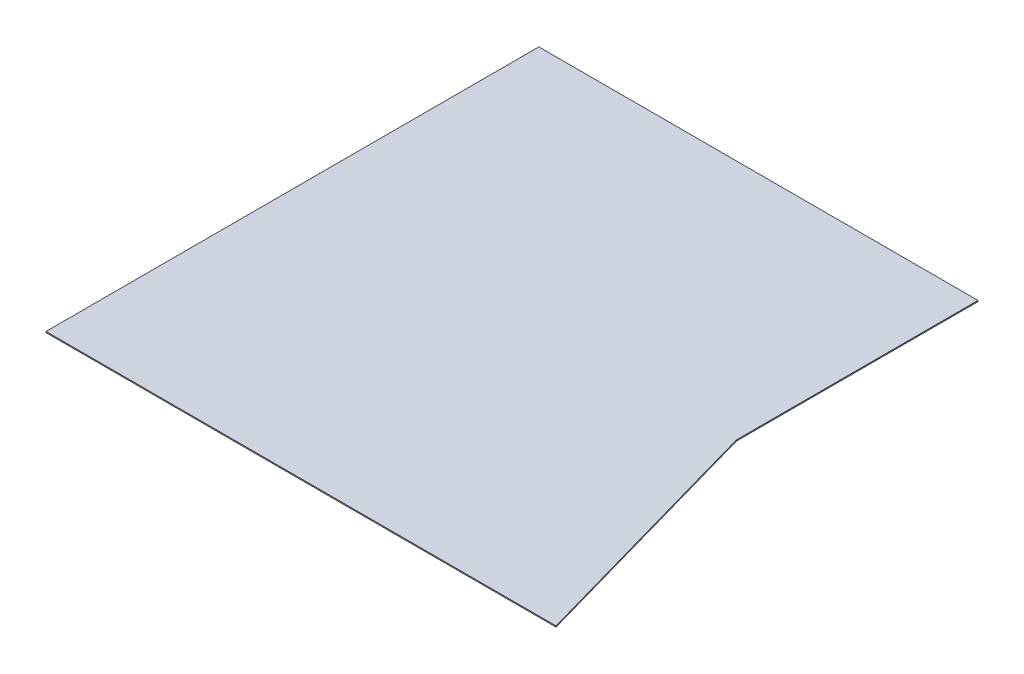
ISO-10303-21;
HEADER;
FILE_DESCRIPTION(('STEP AP214'),'2;1');
FILE_NAME('part.step','',(''),(''),'','','');
FILE_SCHEMA(('AUTOMOTIVE_DESIGN { 1 0 10303 214 1 1 1 1 }'));
ENDSEC;
DATA;
#1=APPLICATION_CONTEXT('core data for automotive mechanical design processes');
#2=APPLICATION_PROTOCOL_DEFINITION('international standard','automotive_design',2000,#1);
#3=PRODUCT_CONTEXT('',#1,'mechanical');
#4=PRODUCT('Part','Part','',(#3));
#5=PRODUCT_RELATED_PRODUCT_CATEGORY('part','',(#4));
#6=PRODUCT_DEFINITION_FORMATION('','',#4);
#7=PRODUCT_DEFINITION_CONTEXT('part definition',#1,'design');
#8=PRODUCT_DEFINITION('design','',#6,#7);
#9=PRODUCT_DEFINITION_SHAPE('','',#8);
#10=(LENGTH_UNIT() NAMED_UNIT(*) SI_UNIT(.MILLI.,.METRE.));
#11=(NAMED_UNIT(*) PLANE_ANGLE_UNIT() SI_UNIT($,.RADIAN.));
#12=(NAMED_UNIT(*) SI_UNIT($,.STERADIAN.) SOLID_ANGLE_UNIT());
#13=UNCERTAINTY_MEASURE_WITH_UNIT(LENGTH_MEASURE(1.E-05),#10,'distance_accuracy_value','');
#14=(GEOMETRIC_REPRESENTATION_CONTEXT(3) GLOBAL_UNCERTAINTY_ASSIGNED_CONTEXT((#13)) GLOBAL_UNIT_ASSIGNED_CONTEXT((#10,
#11,#12)) REPRESENTATION_CONTEXT('',''));
#15=CARTESIAN_POINT('',(0.,0.,0.));
#16=DIRECTION('',(0.,0.,1.));
#17=DIRECTION('',(1.,0.,0.));
#18=AXIS2_PLACEMENT_3D('',#15,#16,#17);
#19=CARTESIAN_POINT('',(-399.549825282321,2.,-85.9990003582993));
#20=DIRECTION('',(1.,0.,0.));
#21=DIRECTION('',(0.,0.,-1.));
#22=AXIS2_PLACEMENT_3D('',#19,#20,#21);
#23=PLANE('',#22);
#24=DIRECTION('',(0.,0.,1.));
#25=VECTOR('',#24,1.);
#26=CARTESIAN_POINT('',(-399.549825282321,0.,-85.9990003582993));
#27=LINE('',#26,#25);
#28=CARTESIAN_POINT('',(-399.549825282321,0.,-85.9990003582993));
#29=VERTEX_POINT('',#28);
#30=CARTESIAN_POINT('',(-399.549825282321,0.,832.000999641701));
#31=VERTEX_POINT('',#30);
#32=EDGE_CURVE('E109',#29,#31,#27,.T.);
#33=ORIENTED_EDGE('',*,*,#32,.T.);
#34=DIRECTION('',(0.,-1.,0.));
#35=VECTOR('',#34,1.);
#36=CARTESIAN_POINT('',(-399.549825282321,2.,832.000999641701));
#37=LINE('',#36,#35);
#38=CARTESIAN_POINT('',(-399.549825282321,2.,832.000999641701));
#39=VERTEX_POINT('',#38);
#40=EDGE_CURVE('E11',#39,#31,#37,.T.);
#41=ORIENTED_EDGE('',*,*,#40,.F.);
#42=DIRECTION('',(0.,0.,1.));
#43=VECTOR('',#42,1.);
#44=CARTESIAN_POINT('',(-399.549825282321,2.,-85.9990003582993));
#45=LINE('',#44,#43);
#46=CARTESIAN_POINT('',(-399.549825282321,2.,-85.9990003582993));
#47=VERTEX_POINT('',#46);
#48=EDGE_CURVE('E117',#47,#39,#45,.T.);
#49=ORIENTED_EDGE('',*,*,#48,.F.);
#50=DIRECTION('',(0.,-1.,0.));
#51=VECTOR('',#50,1.);
#52=CARTESIAN_POINT('',(-399.549825282321,2.,-85.9990003582993));
#53=LINE('',#52,#51);
#54=EDGE_CURVE('E105',#47,#29,#53,.T.);
#55=ORIENTED_EDGE('',*,*,#54,.T.);
#56=EDGE_LOOP('',(#33,#41,#49,#55));
#57=FACE_BOUND('',#56,.T.);
#58=ADVANCED_FACE('F35',(#57),#23,.F.);
#59=CARTESIAN_POINT('',(-399.549825282321,2.,832.000999641701));
#60=DIRECTION('',(0.,0.,-1.));
#61=DIRECTION('',(-1.,0.,0.));
#62=AXIS2_PLACEMENT_3D('',#59,#60,#61);
#63=PLANE('',#62);
#64=DIRECTION('',(1.,0.,0.));
#65=VECTOR('',#64,1.);
#66=CARTESIAN_POINT('',(-399.549825282321,0.,832.000999641701));
#67=LINE('',#66,#65);
#68=CARTESIAN_POINT('',(550.450174717679,0.,832.000999641701));
#69=VERTEX_POINT('',#68);
#70=EDGE_CURVE('E112',#31,#69,#67,.T.);
#71=ORIENTED_EDGE('',*,*,#70,.T.);
#72=DIRECTION('',(0.,-1.,0.));
#73=VECTOR('',#72,1.);
#74=CARTESIAN_POINT('',(550.450174717679,2.,832.000999641701));
#75=LINE('',#74,#73);
#76=CARTESIAN_POINT('',(550.450174717679,2.,832.000999641701));
#77=VERTEX_POINT('',#76);
#78=EDGE_CURVE('E43',#77,#69,#75,.T.);
#79=ORIENTED_EDGE('',*,*,#78,.F.);
#80=DIRECTION('',(1.,0.,0.));
#81=VECTOR('',#80,1.);
#82=CARTESIAN_POINT('',(-399.549825282321,2.,832.000999641701));
#83=LINE('',#82,#81);
#84=EDGE_CURVE('E85',#39,#77,#83,.T.);
#85=ORIENTED_EDGE('',*,*,#84,.F.);
#86=ORIENTED_EDGE('',*,*,#40,.T.);
#87=EDGE_LOOP('',(#71,#79,#85,#86));
#88=FACE_BOUND('',#87,.T.);
#89=ADVANCED_FACE('F136',(#88),#63,.F.);
#90=CARTESIAN_POINT('',(418.450174717679,2.,364.000999641701));
#91=DIRECTION('',(-0.962449675986404,0.,0.271460165021806));
#92=DIRECTION('',(0.271460165021806,0.,0.962449675986404));
#93=AXIS2_PLACEMENT_3D('',#90,#91,#92);
#94=PLANE('',#93);
#95=DIRECTION('',(-0.271460165021806,0.,-0.962449675986404));
#96=VECTOR('',#95,1.);
#97=CARTESIAN_POINT('',(418.450174717679,0.,364.000999641701));
#98=LINE('',#97,#96);
#99=CARTESIAN_POINT('',(418.450174717679,0.,364.000999641701));
#100=VERTEX_POINT('',#99);
#101=EDGE_CURVE('E100',#69,#100,#98,.T.);
#102=ORIENTED_EDGE('',*,*,#101,.T.);
#103=DIRECTION('',(0.,-1.,0.));
#104=VECTOR('',#103,1.);
#105=CARTESIAN_POINT('',(418.450174717679,2.,364.000999641701));
#106=LINE('',#105,#104);
#107=CARTESIAN_POINT('',(418.450174717679,2.,364.000999641701));
#108=VERTEX_POINT('',#107);
#109=EDGE_CURVE('E97',#108,#100,#106,.T.);
#110=ORIENTED_EDGE('',*,*,#109,.F.);
#111=DIRECTION('',(-0.271460165021806,0.,-0.962449675986404));
#112=VECTOR('',#111,1.);
#113=CARTESIAN_POINT('',(418.450174717679,2.,364.000999641701));
#114=LINE('',#113,#112);
#115=EDGE_CURVE('E89',#77,#108,#114,.T.);
#116=ORIENTED_EDGE('',*,*,#115,.F.);
#117=ORIENTED_EDGE('',*,*,#78,.T.);
#118=EDGE_LOOP('',(#102,#110,#116,#117));
#119=FACE_BOUND('',#118,.T.);
#120=ADVANCED_FACE('F98',(#119),#94,.F.);
#121=CARTESIAN_POINT('',(418.450174717679,2.,-85.9990003582993));
#122=DIRECTION('',(-1.,0.,0.));
#123=DIRECTION('',(0.,0.,1.));
#124=AXIS2_PLACEMENT_3D('',#121,#122,#123);
#125=PLANE('',#124);
#126=DIRECTION('',(0.,0.,-1.));
#127=VECTOR('',#126,1.);
#128=CARTESIAN_POINT('',(418.450174717679,0.,-85.9990003582993));
#129=LINE('',#128,#127);
#130=CARTESIAN_POINT('',(418.450174717679,0.,-85.9990003582993));
#131=VERTEX_POINT('',#130);
#132=EDGE_CURVE('E71',#100,#131,#129,.T.);
#133=ORIENTED_EDGE('',*,*,#132,.T.);
#134=DIRECTION('',(0.,-1.,0.));
#135=VECTOR('',#134,1.);
#136=CARTESIAN_POINT('',(418.450174717679,2.,-85.9990003582993));
#137=LINE('',#136,#135);
#138=CARTESIAN_POINT('',(418.450174717679,2.,-85.9990003582993));
#139=VERTEX_POINT('',#138);
#140=EDGE_CURVE('E101',#139,#131,#137,.T.);
#141=ORIENTED_EDGE('',*,*,#140,.F.);
#142=DIRECTION('',(0.,0.,-1.));
#143=VECTOR('',#142,1.);
#144=CARTESIAN_POINT('',(418.450174717679,2.,-85.9990003582993));
#145=LINE('',#144,#143);
#146=EDGE_CURVE('E93',#108,#139,#145,.T.);
#147=ORIENTED_EDGE('',*,*,#146,.F.);
#148=ORIENTED_EDGE('',*,*,#109,.T.);
#149=EDGE_LOOP('',(#133,#141,#147,#148));
#150=FACE_BOUND('',#149,.T.);
#151=ADVANCED_FACE('F103',(#150),#125,.F.);
#152=CARTESIAN_POINT('',(-399.549825282321,2.,-85.9990003582993));
#153=DIRECTION('',(0.,0.,1.));
#154=DIRECTION('',(1.,0.,0.));
#155=AXIS2_PLACEMENT_3D('',#152,#153,#154);
#156=PLANE('',#155);
#157=DIRECTION('',(-1.,0.,0.));
#158=VECTOR('',#157,1.);
#159=CARTESIAN_POINT('',(-399.549825282321,0.,-85.9990003582993));
#160=LINE('',#159,#158);
#161=EDGE_CURVE('E77',#131,#29,#160,.T.);
#162=ORIENTED_EDGE('',*,*,#161,.T.);
#163=ORIENTED_EDGE('',*,*,#54,.F.);
#164=DIRECTION('',(-1.,0.,0.));
#165=VECTOR('',#164,1.);
#166=CARTESIAN_POINT('',(-399.549825282321,2.,-85.9990003582993));
#167=LINE('',#166,#165);
#168=EDGE_CURVE('E51',#139,#47,#167,.T.);
#169=ORIENTED_EDGE('',*,*,#168,.F.);
#170=ORIENTED_EDGE('',*,*,#140,.T.);
#171=EDGE_LOOP('',(#162,#163,#169,#170));
#172=FACE_BOUND('',#171,.T.);
#173=ADVANCED_FACE('F125',(#172),#156,.F.);
#174=CARTESIAN_POINT('',(0.,2.,0.));
#175=DIRECTION('',(0.,1.,0.));
#176=DIRECTION('',(0.,0.,1.));
#177=AXIS2_PLACEMENT_3D('',#174,#175,#176);
#178=PLANE('',#177);
#179=ORIENTED_EDGE('',*,*,#48,.T.);
#180=ORIENTED_EDGE('',*,*,#84,.T.);
#181=ORIENTED_EDGE('',*,*,#115,.T.);
#182=ORIENTED_EDGE('',*,*,#146,.T.);
#183=ORIENTED_EDGE('',*,*,#168,.T.);
#184=EDGE_LOOP('',(#179,#180,#181,#182,#183));
#185=FACE_BOUND('',#184,.T.);
#186=ADVANCED_FACE('F91',(#185),#178,.T.);
#187=CARTESIAN_POINT('',(0.,0.,0.));
#188=DIRECTION('',(0.,1.,0.));
#189=DIRECTION('',(0.,0.,1.));
#190=AXIS2_PLACEMENT_3D('',#187,#188,#189);
#191=PLANE('',#190);
#192=ORIENTED_EDGE('',*,*,#32,.F.);
#193=ORIENTED_EDGE('',*,*,#161,.F.);
#194=ORIENTED_EDGE('',*,*,#132,.F.);
#195=ORIENTED_EDGE('',*,*,#101,.F.);
#196=ORIENTED_EDGE('',*,*,#70,.F.);
#197=EDGE_LOOP('',(#192,#193,#194,#195,#196));
#198=FACE_BOUND('',#197,.T.);
#199=ADVANCED_FACE('F121',(#198),#191,.F.);
#200=CLOSED_SHELL('',(#58,#89,#120,#151,#173,#186,#199));
#201=MANIFOLD_SOLID_BREP('B2',#200);
#202=ADVANCED_BREP_SHAPE_REPRESENTATION('',(#18,#201),#14);
#203=SHAPE_DEFINITION_REPRESENTATION(#9,#202);
ENDSEC;
END-ISO-10303-21;
